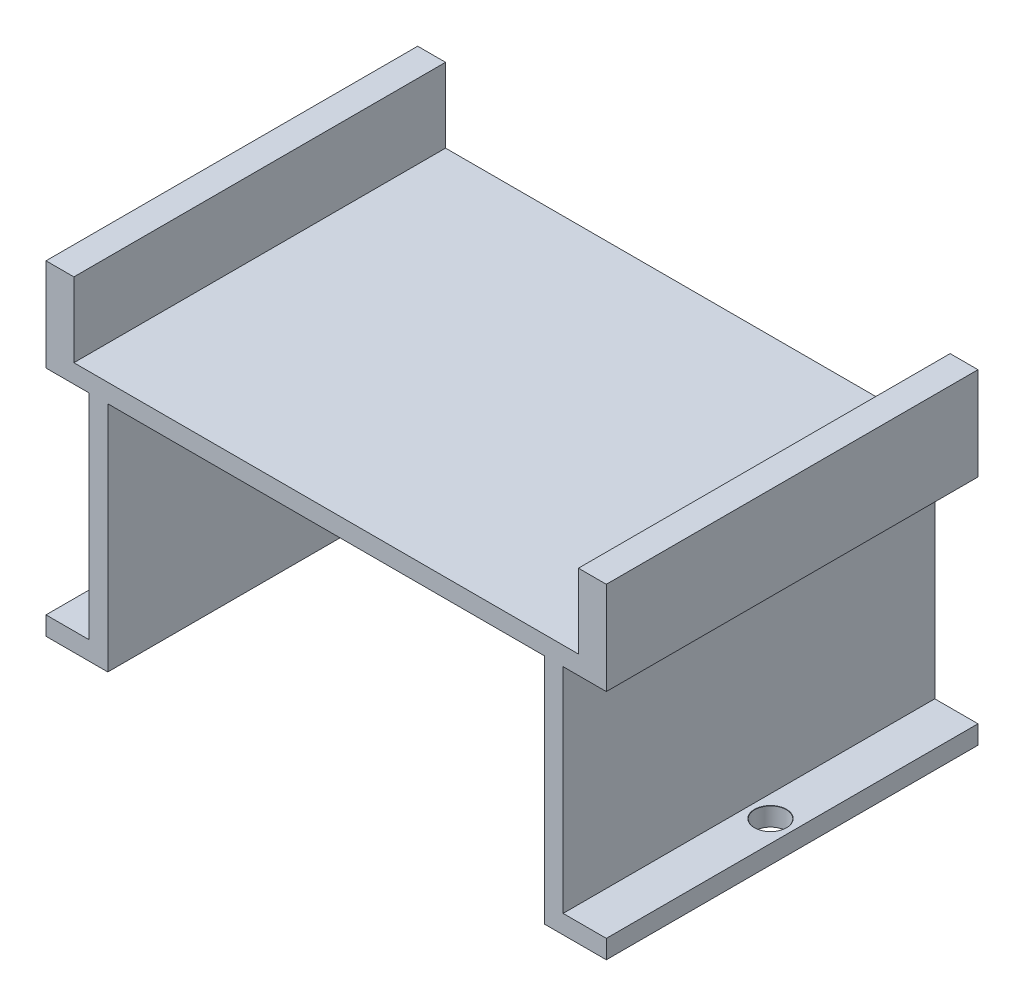
ISO-10303-21;
HEADER;
FILE_DESCRIPTION(('STEP AP214'),'2;1');
FILE_NAME('part.step','',(''),(''),'','','');
FILE_SCHEMA(('AUTOMOTIVE_DESIGN { 1 0 10303 214 1 1 1 1 }'));
ENDSEC;
DATA;
#1=APPLICATION_CONTEXT('core data for automotive mechanical design processes');
#2=APPLICATION_PROTOCOL_DEFINITION('international standard','automotive_design',2000,#1);
#3=PRODUCT_CONTEXT('',#1,'mechanical');
#4=PRODUCT('Part','Part','',(#3));
#5=PRODUCT_RELATED_PRODUCT_CATEGORY('part','',(#4));
#6=PRODUCT_DEFINITION_FORMATION('','',#4);
#7=PRODUCT_DEFINITION_CONTEXT('part definition',#1,'design');
#8=PRODUCT_DEFINITION('design','',#6,#7);
#9=PRODUCT_DEFINITION_SHAPE('','',#8);
#10=(LENGTH_UNIT() NAMED_UNIT(*) SI_UNIT(.MILLI.,.METRE.));
#11=(NAMED_UNIT(*) PLANE_ANGLE_UNIT() SI_UNIT($,.RADIAN.));
#12=(NAMED_UNIT(*) SI_UNIT($,.STERADIAN.) SOLID_ANGLE_UNIT());
#13=UNCERTAINTY_MEASURE_WITH_UNIT(LENGTH_MEASURE(1.E-05),#10,'distance_accuracy_value','');
#14=(GEOMETRIC_REPRESENTATION_CONTEXT(3) GLOBAL_UNCERTAINTY_ASSIGNED_CONTEXT((#13)) GLOBAL_UNIT_ASSIGNED_CONTEXT((#10,
#11,#12)) REPRESENTATION_CONTEXT('',''));
#15=CARTESIAN_POINT('',(0.,0.,0.));
#16=DIRECTION('',(0.,0.,1.));
#17=DIRECTION('',(1.,0.,0.));
#18=AXIS2_PLACEMENT_3D('',#15,#16,#17);
#19=CARTESIAN_POINT('',(30.15,17.5,40.));
#20=DIRECTION('',(-1.,0.,0.));
#21=DIRECTION('',(0.,-1.,0.));
#22=AXIS2_PLACEMENT_3D('',#19,#20,#21);
#23=PLANE('',#22);
#24=DIRECTION('',(0.,1.,0.));
#25=VECTOR('',#24,1.);
#26=CARTESIAN_POINT('',(30.15,17.5,40.));
#27=LINE('',#26,#25);
#28=CARTESIAN_POINT('',(30.15,7.5,40.));
#29=VERTEX_POINT('',#28);
#30=CARTESIAN_POINT('',(30.15,17.5,40.));
#31=VERTEX_POINT('',#30);
#32=EDGE_CURVE('E222',#29,#31,#27,.T.);
#33=ORIENTED_EDGE('',*,*,#32,.F.);
#34=DIRECTION('',(0.,0.,-1.));
#35=VECTOR('',#34,1.);
#36=CARTESIAN_POINT('',(30.15,7.5,40.));
#37=LINE('',#36,#35);
#38=CARTESIAN_POINT('',(30.15,7.5,0.));
#39=VERTEX_POINT('',#38);
#40=EDGE_CURVE('E241',#29,#39,#37,.T.);
#41=ORIENTED_EDGE('',*,*,#40,.T.);
#42=DIRECTION('',(0.,1.,0.));
#43=VECTOR('',#42,1.);
#44=CARTESIAN_POINT('',(30.15,17.5,0.));
#45=LINE('',#44,#43);
#46=CARTESIAN_POINT('',(30.15,17.5,0.));
#47=VERTEX_POINT('',#46);
#48=EDGE_CURVE('E321',#39,#47,#45,.T.);
#49=ORIENTED_EDGE('',*,*,#48,.T.);
#50=DIRECTION('',(0.,0.,-1.));
#51=VECTOR('',#50,1.);
#52=CARTESIAN_POINT('',(30.15,17.5,40.));
#53=LINE('',#52,#51);
#54=EDGE_CURVE('E11',#31,#47,#53,.T.);
#55=ORIENTED_EDGE('',*,*,#54,.F.);
#56=EDGE_LOOP('',(#33,#41,#49,#55));
#57=FACE_BOUND('',#56,.T.);
#58=ADVANCED_FACE('F45',(#57),#23,.F.);
#59=CARTESIAN_POINT('',(-30.15,17.5,40.));
#60=DIRECTION('',(0.,-1.,0.));
#61=DIRECTION('',(0.,0.,-1.));
#62=AXIS2_PLACEMENT_3D('',#59,#60,#61);
#63=PLANE('',#62);
#64=DIRECTION('',(-1.,0.,0.));
#65=VECTOR('',#64,1.);
#66=CARTESIAN_POINT('',(-30.15,17.5,0.));
#67=LINE('',#66,#65);
#68=CARTESIAN_POINT('',(27.15,17.5,0.));
#69=VERTEX_POINT('',#68);
#70=EDGE_CURVE('E212',#47,#69,#67,.T.);
#71=ORIENTED_EDGE('',*,*,#70,.T.);
#72=DIRECTION('',(0.,0.,-1.));
#73=VECTOR('',#72,1.);
#74=CARTESIAN_POINT('',(27.15,17.5,40.));
#75=LINE('',#74,#73);
#76=CARTESIAN_POINT('',(27.15,17.5,40.));
#77=VERTEX_POINT('',#76);
#78=EDGE_CURVE('E263',#77,#69,#75,.T.);
#79=ORIENTED_EDGE('',*,*,#78,.F.);
#80=DIRECTION('',(-1.,0.,0.));
#81=VECTOR('',#80,1.);
#82=CARTESIAN_POINT('',(-30.15,17.5,40.));
#83=LINE('',#82,#81);
#84=EDGE_CURVE('E332',#31,#77,#83,.T.);
#85=ORIENTED_EDGE('',*,*,#84,.F.);
#86=ORIENTED_EDGE('',*,*,#54,.T.);
#87=EDGE_LOOP('',(#71,#79,#85,#86));
#88=FACE_BOUND('',#87,.T.);
#89=ADVANCED_FACE('F352',(#88),#63,.F.);
#90=CARTESIAN_POINT('',(-30.15,17.5,40.));
#91=DIRECTION('',(1.,0.,0.));
#92=DIRECTION('',(0.,1.,0.));
#93=AXIS2_PLACEMENT_3D('',#90,#91,#92);
#94=PLANE('',#93);
#95=DIRECTION('',(0.,-1.,0.));
#96=VECTOR('',#95,1.);
#97=CARTESIAN_POINT('',(-30.15,17.5,40.));
#98=LINE('',#97,#96);
#99=CARTESIAN_POINT('',(-30.15,-15.5,40.));
#100=VERTEX_POINT('',#99);
#101=CARTESIAN_POINT('',(-30.15,-17.5,40.));
#102=VERTEX_POINT('',#101);
#103=EDGE_CURVE('E202',#100,#102,#98,.T.);
#104=ORIENTED_EDGE('',*,*,#103,.F.);
#105=DIRECTION('',(0.,0.,-1.));
#106=VECTOR('',#105,1.);
#107=CARTESIAN_POINT('',(-30.15,-15.5,40.));
#108=LINE('',#107,#106);
#109=CARTESIAN_POINT('',(-30.15,-15.5,0.));
#110=VERTEX_POINT('',#109);
#111=EDGE_CURVE('E186',#100,#110,#108,.T.);
#112=ORIENTED_EDGE('',*,*,#111,.T.);
#113=DIRECTION('',(0.,-1.,0.));
#114=VECTOR('',#113,1.);
#115=CARTESIAN_POINT('',(-30.15,17.5,0.));
#116=LINE('',#115,#114);
#117=CARTESIAN_POINT('',(-30.15,-17.5,0.));
#118=VERTEX_POINT('',#117);
#119=EDGE_CURVE('E200',#110,#118,#116,.T.);
#120=ORIENTED_EDGE('',*,*,#119,.T.);
#121=DIRECTION('',(0.,0.,-1.));
#122=VECTOR('',#121,1.);
#123=CARTESIAN_POINT('',(-30.15,-17.5,40.));
#124=LINE('',#123,#122);
#125=EDGE_CURVE('E226',#102,#118,#124,.T.);
#126=ORIENTED_EDGE('',*,*,#125,.F.);
#127=EDGE_LOOP('',(#104,#112,#120,#126));
#128=FACE_BOUND('',#127,.T.);
#129=ADVANCED_FACE('F198',(#128),#94,.F.);
#130=CARTESIAN_POINT('',(-30.15,-17.5,40.));
#131=DIRECTION('',(0.,1.,0.));
#132=DIRECTION('',(0.,0.,1.));
#133=AXIS2_PLACEMENT_3D('',#130,#131,#132);
#134=PLANE('',#133);
#135=CARTESIAN_POINT('',(27.82,-17.5,20.));
#136=DIRECTION('',(0.,1.,0.));
#137=DIRECTION('',(0.,0.,1.));
#138=AXIS2_PLACEMENT_3D('',#135,#136,#137);
#139=CIRCLE('',#138,1.69999999999999);
#140=CARTESIAN_POINT('',(27.82,-17.5,21.7));
#141=VERTEX_POINT('',#140);
#142=EDGE_CURVE('E401',#141,#141,#139,.T.);
#143=ORIENTED_EDGE('',*,*,#142,.T.);
#144=EDGE_LOOP('',(#143));
#145=FACE_BOUND('',#144,.T.);
#146=DIRECTION('',(1.,0.,0.));
#147=VECTOR('',#146,1.);
#148=CARTESIAN_POINT('',(-30.15,-17.5,40.));
#149=LINE('',#148,#147);
#150=CARTESIAN_POINT('',(23.5,-17.5,40.));
#151=VERTEX_POINT('',#150);
#152=CARTESIAN_POINT('',(30.15,-17.5,40.));
#153=VERTEX_POINT('',#152);
#154=EDGE_CURVE('E336',#151,#153,#149,.T.);
#155=ORIENTED_EDGE('',*,*,#154,.F.);
#156=DIRECTION('',(0.,0.,-1.));
#157=VECTOR('',#156,1.);
#158=CARTESIAN_POINT('',(23.5,-17.5,40.));
#159=LINE('',#158,#157);
#160=CARTESIAN_POINT('',(23.5,-17.5,0.));
#161=VERTEX_POINT('',#160);
#162=EDGE_CURVE('E312',#151,#161,#159,.T.);
#163=ORIENTED_EDGE('',*,*,#162,.T.);
#164=DIRECTION('',(1.,0.,0.));
#165=VECTOR('',#164,1.);
#166=CARTESIAN_POINT('',(-30.15,-17.5,0.));
#167=LINE('',#166,#165);
#168=CARTESIAN_POINT('',(30.15,-17.5,0.));
#169=VERTEX_POINT('',#168);
#170=EDGE_CURVE('E215',#161,#169,#167,.T.);
#171=ORIENTED_EDGE('',*,*,#170,.T.);
#172=DIRECTION('',(0.,0.,-1.));
#173=VECTOR('',#172,1.);
#174=CARTESIAN_POINT('',(30.15,-17.5,40.));
#175=LINE('',#174,#173);
#176=EDGE_CURVE('E223',#153,#169,#175,.T.);
#177=ORIENTED_EDGE('',*,*,#176,.F.);
#178=EDGE_LOOP('',(#155,#163,#171,#177));
#179=FACE_BOUND('',#178,.T.);
#180=ADVANCED_FACE('F370',(#145,#179),#134,.F.);
#181=CARTESIAN_POINT('',(30.15,-15.5,0.));
#182=VERTEX_POINT('',#181);
#183=EDGE_CURVE('E338',#169,#182,#45,.T.);
#184=ORIENTED_EDGE('',*,*,#183,.T.);
#185=DIRECTION('',(0.,0.,-1.));
#186=VECTOR('',#185,1.);
#187=CARTESIAN_POINT('',(30.15,-15.5,40.));
#188=LINE('',#187,#186);
#189=CARTESIAN_POINT('',(30.15,-15.5,40.));
#190=VERTEX_POINT('',#189);
#191=EDGE_CURVE('E281',#190,#182,#188,.T.);
#192=ORIENTED_EDGE('',*,*,#191,.F.);
#193=EDGE_CURVE('E328',#153,#190,#27,.T.);
#194=ORIENTED_EDGE('',*,*,#193,.F.);
#195=ORIENTED_EDGE('',*,*,#176,.T.);
#196=EDGE_LOOP('',(#184,#192,#194,#195));
#197=FACE_BOUND('',#196,.T.);
#198=ADVANCED_FACE('F47',(#197),#23,.F.);
#199=CARTESIAN_POINT('',(-27.15,17.5,40.));
#200=VERTEX_POINT('',#199);
#201=CARTESIAN_POINT('',(-30.15,17.5,40.));
#202=VERTEX_POINT('',#201);
#203=EDGE_CURVE('E331',#200,#202,#83,.T.);
#204=ORIENTED_EDGE('',*,*,#203,.F.);
#205=DIRECTION('',(0.,0.,-1.));
#206=VECTOR('',#205,1.);
#207=CARTESIAN_POINT('',(-27.15,17.5,40.));
#208=LINE('',#207,#206);
#209=CARTESIAN_POINT('',(-27.15,17.5,0.));
#210=VERTEX_POINT('',#209);
#211=EDGE_CURVE('E260',#200,#210,#208,.T.);
#212=ORIENTED_EDGE('',*,*,#211,.T.);
#213=CARTESIAN_POINT('',(-30.15,17.5,0.));
#214=VERTEX_POINT('',#213);
#215=EDGE_CURVE('E217',#210,#214,#67,.T.);
#216=ORIENTED_EDGE('',*,*,#215,.T.);
#217=DIRECTION('',(0.,0.,-1.));
#218=VECTOR('',#217,1.);
#219=CARTESIAN_POINT('',(-30.15,17.5,40.));
#220=LINE('',#219,#218);
#221=EDGE_CURVE('E53',#202,#214,#220,.T.);
#222=ORIENTED_EDGE('',*,*,#221,.F.);
#223=EDGE_LOOP('',(#204,#212,#216,#222));
#224=FACE_BOUND('',#223,.T.);
#225=ADVANCED_FACE('F428',(#224),#63,.F.);
#226=CARTESIAN_POINT('',(-30.15,7.5,0.));
#227=VERTEX_POINT('',#226);
#228=EDGE_CURVE('E211',#214,#227,#116,.T.);
#229=ORIENTED_EDGE('',*,*,#228,.T.);
#230=DIRECTION('',(0.,0.,-1.));
#231=VECTOR('',#230,1.);
#232=CARTESIAN_POINT('',(-30.15,7.5,40.));
#233=LINE('',#232,#231);
#234=CARTESIAN_POINT('',(-30.15,7.5,40.));
#235=VERTEX_POINT('',#234);
#236=EDGE_CURVE('E68',#235,#227,#233,.T.);
#237=ORIENTED_EDGE('',*,*,#236,.F.);
#238=EDGE_CURVE('E235',#202,#235,#98,.T.);
#239=ORIENTED_EDGE('',*,*,#238,.F.);
#240=ORIENTED_EDGE('',*,*,#221,.T.);
#241=EDGE_LOOP('',(#229,#237,#239,#240));
#242=FACE_BOUND('',#241,.T.);
#243=ADVANCED_FACE('F233',(#242),#94,.F.);
#244=CARTESIAN_POINT('',(-27.82,-17.5,20.));
#245=DIRECTION('',(0.,1.,0.));
#246=DIRECTION('',(0.,0.,1.));
#247=AXIS2_PLACEMENT_3D('',#244,#245,#246);
#248=CIRCLE('',#247,1.69999999999999);
#249=CARTESIAN_POINT('',(-27.82,-17.5,21.7));
#250=VERTEX_POINT('',#249);
#251=EDGE_CURVE('E203',#250,#250,#248,.T.);
#252=ORIENTED_EDGE('',*,*,#251,.T.);
#253=EDGE_LOOP('',(#252));
#254=FACE_BOUND('',#253,.T.);
#255=CARTESIAN_POINT('',(-23.5,-17.5,0.));
#256=VERTEX_POINT('',#255);
#257=EDGE_CURVE('E210',#118,#256,#167,.T.);
#258=ORIENTED_EDGE('',*,*,#257,.T.);
#259=DIRECTION('',(0.,0.,-1.));
#260=VECTOR('',#259,1.);
#261=CARTESIAN_POINT('',(-23.5,-17.5,40.));
#262=LINE('',#261,#260);
#263=CARTESIAN_POINT('',(-23.5,-17.5,40.));
#264=VERTEX_POINT('',#263);
#265=EDGE_CURVE('E324',#264,#256,#262,.T.);
#266=ORIENTED_EDGE('',*,*,#265,.F.);
#267=EDGE_CURVE('E227',#102,#264,#149,.T.);
#268=ORIENTED_EDGE('',*,*,#267,.F.);
#269=ORIENTED_EDGE('',*,*,#125,.T.);
#270=EDGE_LOOP('',(#258,#266,#268,#269));
#271=FACE_BOUND('',#270,.T.);
#272=ADVANCED_FACE('F383',(#254,#271),#134,.F.);
#273=CARTESIAN_POINT('',(0.,0.,40.));
#274=DIRECTION('',(0.,0.,1.));
#275=DIRECTION('',(1.,0.,0.));
#276=AXIS2_PLACEMENT_3D('',#273,#274,#275);
#277=PLANE('',#276);
#278=DIRECTION('',(0.,-1.,0.));
#279=VECTOR('',#278,1.);
#280=CARTESIAN_POINT('',(27.15,17.5,40.));
#281=LINE('',#280,#279);
#282=CARTESIAN_POINT('',(27.15,9.5,40.));
#283=VERTEX_POINT('',#282);
#284=EDGE_CURVE('E269',#77,#283,#281,.T.);
#285=ORIENTED_EDGE('',*,*,#284,.T.);
#286=DIRECTION('',(-1.,0.,0.));
#287=VECTOR('',#286,1.);
#288=CARTESIAN_POINT('',(27.15,9.5,40.));
#289=LINE('',#288,#287);
#290=CARTESIAN_POINT('',(-27.15,9.5,40.));
#291=VERTEX_POINT('',#290);
#292=EDGE_CURVE('E276',#283,#291,#289,.T.);
#293=ORIENTED_EDGE('',*,*,#292,.T.);
#294=DIRECTION('',(0.,1.,0.));
#295=VECTOR('',#294,1.);
#296=CARTESIAN_POINT('',(-27.15,17.5,40.));
#297=LINE('',#296,#295);
#298=EDGE_CURVE('E257',#291,#200,#297,.T.);
#299=ORIENTED_EDGE('',*,*,#298,.T.);
#300=ORIENTED_EDGE('',*,*,#203,.T.);
#301=ORIENTED_EDGE('',*,*,#238,.T.);
#302=DIRECTION('',(1.,0.,0.));
#303=VECTOR('',#302,1.);
#304=CARTESIAN_POINT('',(-30.15,7.5,40.));
#305=LINE('',#304,#303);
#306=CARTESIAN_POINT('',(-25.5,7.5,40.));
#307=VERTEX_POINT('',#306);
#308=EDGE_CURVE('E194',#235,#307,#305,.T.);
#309=ORIENTED_EDGE('',*,*,#308,.T.);
#310=DIRECTION('',(0.,-1.,0.));
#311=VECTOR('',#310,1.);
#312=CARTESIAN_POINT('',(-25.5,7.5,40.));
#313=LINE('',#312,#311);
#314=CARTESIAN_POINT('',(-25.5,-15.5,40.));
#315=VERTEX_POINT('',#314);
#316=EDGE_CURVE('E250',#307,#315,#313,.T.);
#317=ORIENTED_EDGE('',*,*,#316,.T.);
#318=DIRECTION('',(-1.,0.,0.));
#319=VECTOR('',#318,1.);
#320=CARTESIAN_POINT('',(-30.15,-15.5,40.));
#321=LINE('',#320,#319);
#322=EDGE_CURVE('E248',#315,#100,#321,.T.);
#323=ORIENTED_EDGE('',*,*,#322,.T.);
#324=ORIENTED_EDGE('',*,*,#103,.T.);
#325=ORIENTED_EDGE('',*,*,#267,.T.);
#326=DIRECTION('',(0.,1.,0.));
#327=VECTOR('',#326,1.);
#328=CARTESIAN_POINT('',(-23.5,7.5,40.));
#329=LINE('',#328,#327);
#330=CARTESIAN_POINT('',(-23.5,7.5,40.));
#331=VERTEX_POINT('',#330);
#332=EDGE_CURVE('E305',#264,#331,#329,.T.);
#333=ORIENTED_EDGE('',*,*,#332,.T.);
#334=DIRECTION('',(1.,0.,0.));
#335=VECTOR('',#334,1.);
#336=CARTESIAN_POINT('',(23.5,7.5,40.));
#337=LINE('',#336,#335);
#338=CARTESIAN_POINT('',(23.5,7.5,40.));
#339=VERTEX_POINT('',#338);
#340=EDGE_CURVE('E309',#331,#339,#337,.T.);
#341=ORIENTED_EDGE('',*,*,#340,.T.);
#342=DIRECTION('',(0.,-1.,0.));
#343=VECTOR('',#342,1.);
#344=CARTESIAN_POINT('',(23.5,7.5,40.));
#345=LINE('',#344,#343);
#346=EDGE_CURVE('E302',#339,#151,#345,.T.);
#347=ORIENTED_EDGE('',*,*,#346,.T.);
#348=ORIENTED_EDGE('',*,*,#154,.T.);
#349=ORIENTED_EDGE('',*,*,#193,.T.);
#350=DIRECTION('',(-1.,0.,0.));
#351=VECTOR('',#350,1.);
#352=CARTESIAN_POINT('',(30.15,-15.5,40.));
#353=LINE('',#352,#351);
#354=CARTESIAN_POINT('',(25.5,-15.5,40.));
#355=VERTEX_POINT('',#354);
#356=EDGE_CURVE('E290',#190,#355,#353,.T.);
#357=ORIENTED_EDGE('',*,*,#356,.T.);
#358=DIRECTION('',(0.,1.,0.));
#359=VECTOR('',#358,1.);
#360=CARTESIAN_POINT('',(25.5,7.5,40.));
#361=LINE('',#360,#359);
#362=CARTESIAN_POINT('',(25.5,7.5,40.));
#363=VERTEX_POINT('',#362);
#364=EDGE_CURVE('E297',#355,#363,#361,.T.);
#365=ORIENTED_EDGE('',*,*,#364,.T.);
#366=DIRECTION('',(1.,0.,0.));
#367=VECTOR('',#366,1.);
#368=CARTESIAN_POINT('',(30.15,7.5,40.));
#369=LINE('',#368,#367);
#370=EDGE_CURVE('E283',#363,#29,#369,.T.);
#371=ORIENTED_EDGE('',*,*,#370,.T.);
#372=ORIENTED_EDGE('',*,*,#32,.T.);
#373=ORIENTED_EDGE('',*,*,#84,.T.);
#374=EDGE_LOOP('',(#285,#293,#299,#300,#301,#309,#317,#323,#324,#325,#333,#341,#347,#348,#349,
#357,#365,#371,#372,#373));
#375=FACE_BOUND('',#374,.T.);
#376=ADVANCED_FACE('F354',(#375),#277,.T.);
#377=CARTESIAN_POINT('',(0.,0.,0.));
#378=DIRECTION('',(0.,0.,1.));
#379=DIRECTION('',(1.,0.,0.));
#380=AXIS2_PLACEMENT_3D('',#377,#378,#379);
#381=PLANE('',#380);
#382=DIRECTION('',(-1.,0.,0.));
#383=VECTOR('',#382,1.);
#384=CARTESIAN_POINT('',(27.15,9.5,0.));
#385=LINE('',#384,#383);
#386=CARTESIAN_POINT('',(27.15,9.5,0.));
#387=VERTEX_POINT('',#386);
#388=CARTESIAN_POINT('',(-27.15,9.5,0.));
#389=VERTEX_POINT('',#388);
#390=EDGE_CURVE('E268',#387,#389,#385,.T.);
#391=ORIENTED_EDGE('',*,*,#390,.F.);
#392=DIRECTION('',(0.,-1.,0.));
#393=VECTOR('',#392,1.);
#394=CARTESIAN_POINT('',(27.15,17.5,0.));
#395=LINE('',#394,#393);
#396=EDGE_CURVE('E60',#69,#387,#395,.T.);
#397=ORIENTED_EDGE('',*,*,#396,.F.);
#398=ORIENTED_EDGE('',*,*,#70,.F.);
#399=ORIENTED_EDGE('',*,*,#48,.F.);
#400=DIRECTION('',(1.,0.,0.));
#401=VECTOR('',#400,1.);
#402=CARTESIAN_POINT('',(30.15,7.5,0.));
#403=LINE('',#402,#401);
#404=CARTESIAN_POINT('',(25.5,7.5,0.));
#405=VERTEX_POINT('',#404);
#406=EDGE_CURVE('E287',#405,#39,#403,.T.);
#407=ORIENTED_EDGE('',*,*,#406,.F.);
#408=DIRECTION('',(0.,1.,0.));
#409=VECTOR('',#408,1.);
#410=CARTESIAN_POINT('',(25.5,7.5,0.));
#411=LINE('',#410,#409);
#412=CARTESIAN_POINT('',(25.5,-15.5,0.));
#413=VERTEX_POINT('',#412);
#414=EDGE_CURVE('E289',#413,#405,#411,.T.);
#415=ORIENTED_EDGE('',*,*,#414,.F.);
#416=DIRECTION('',(-1.,0.,0.));
#417=VECTOR('',#416,1.);
#418=CARTESIAN_POINT('',(30.15,-15.5,0.));
#419=LINE('',#418,#417);
#420=EDGE_CURVE('E265',#182,#413,#419,.T.);
#421=ORIENTED_EDGE('',*,*,#420,.F.);
#422=ORIENTED_EDGE('',*,*,#183,.F.);
#423=ORIENTED_EDGE('',*,*,#170,.F.);
#424=DIRECTION('',(0.,-1.,0.));
#425=VECTOR('',#424,1.);
#426=CARTESIAN_POINT('',(23.5,7.5,0.));
#427=LINE('',#426,#425);
#428=CARTESIAN_POINT('',(23.5,7.5,0.));
#429=VERTEX_POINT('',#428);
#430=EDGE_CURVE('E273',#429,#161,#427,.T.);
#431=ORIENTED_EDGE('',*,*,#430,.F.);
#432=DIRECTION('',(1.,0.,0.));
#433=VECTOR('',#432,1.);
#434=CARTESIAN_POINT('',(23.5,7.5,0.));
#435=LINE('',#434,#433);
#436=CARTESIAN_POINT('',(-23.5,7.5,0.));
#437=VERTEX_POINT('',#436);
#438=EDGE_CURVE('E306',#437,#429,#435,.T.);
#439=ORIENTED_EDGE('',*,*,#438,.F.);
#440=DIRECTION('',(0.,1.,0.));
#441=VECTOR('',#440,1.);
#442=CARTESIAN_POINT('',(-23.5,7.5,0.));
#443=LINE('',#442,#441);
#444=EDGE_CURVE('E314',#256,#437,#443,.T.);
#445=ORIENTED_EDGE('',*,*,#444,.F.);
#446=ORIENTED_EDGE('',*,*,#257,.F.);
#447=ORIENTED_EDGE('',*,*,#119,.F.);
#448=DIRECTION('',(-1.,0.,0.));
#449=VECTOR('',#448,1.);
#450=CARTESIAN_POINT('',(-30.15,-15.5,0.));
#451=LINE('',#450,#449);
#452=CARTESIAN_POINT('',(-25.5,-15.5,0.));
#453=VERTEX_POINT('',#452);
#454=EDGE_CURVE('E182',#453,#110,#451,.T.);
#455=ORIENTED_EDGE('',*,*,#454,.F.);
#456=DIRECTION('',(0.,-1.,0.));
#457=VECTOR('',#456,1.);
#458=CARTESIAN_POINT('',(-25.5,7.5,0.));
#459=LINE('',#458,#457);
#460=CARTESIAN_POINT('',(-25.5,7.5,0.));
#461=VERTEX_POINT('',#460);
#462=EDGE_CURVE('E193',#461,#453,#459,.T.);
#463=ORIENTED_EDGE('',*,*,#462,.F.);
#464=DIRECTION('',(1.,0.,0.));
#465=VECTOR('',#464,1.);
#466=CARTESIAN_POINT('',(-30.15,7.5,0.));
#467=LINE('',#466,#465);
#468=EDGE_CURVE('E240',#227,#461,#467,.T.);
#469=ORIENTED_EDGE('',*,*,#468,.F.);
#470=ORIENTED_EDGE('',*,*,#228,.F.);
#471=ORIENTED_EDGE('',*,*,#215,.F.);
#472=DIRECTION('',(0.,1.,0.));
#473=VECTOR('',#472,1.);
#474=CARTESIAN_POINT('',(-27.15,17.5,0.));
#475=LINE('',#474,#473);
#476=EDGE_CURVE('E266',#389,#210,#475,.T.);
#477=ORIENTED_EDGE('',*,*,#476,.F.);
#478=EDGE_LOOP('',(#391,#397,#398,#399,#407,#415,#421,#422,#423,#431,#439,#445,#446,#447,#455,
#463,#469,#470,#471,#477));
#479=FACE_BOUND('',#478,.T.);
#480=ADVANCED_FACE('F207',(#479),#381,.F.);
#481=CARTESIAN_POINT('',(23.5,7.5,40.));
#482=DIRECTION('',(1.,0.,0.));
#483=DIRECTION('',(0.,1.,0.));
#484=AXIS2_PLACEMENT_3D('',#481,#482,#483);
#485=PLANE('',#484);
#486=ORIENTED_EDGE('',*,*,#430,.T.);
#487=ORIENTED_EDGE('',*,*,#162,.F.);
#488=ORIENTED_EDGE('',*,*,#346,.F.);
#489=DIRECTION('',(0.,0.,-1.));
#490=VECTOR('',#489,1.);
#491=CARTESIAN_POINT('',(23.5,7.5,40.));
#492=LINE('',#491,#490);
#493=EDGE_CURVE('E319',#339,#429,#492,.T.);
#494=ORIENTED_EDGE('',*,*,#493,.T.);
#495=EDGE_LOOP('',(#486,#487,#488,#494));
#496=FACE_BOUND('',#495,.T.);
#497=ADVANCED_FACE('F375',(#496),#485,.F.);
#498=CARTESIAN_POINT('',(23.5,7.5,40.));
#499=DIRECTION('',(0.,1.,0.));
#500=DIRECTION('',(0.,0.,1.));
#501=AXIS2_PLACEMENT_3D('',#498,#499,#500);
#502=PLANE('',#501);
#503=ORIENTED_EDGE('',*,*,#438,.T.);
#504=ORIENTED_EDGE('',*,*,#493,.F.);
#505=ORIENTED_EDGE('',*,*,#340,.F.);
#506=DIRECTION('',(0.,0.,-1.));
#507=VECTOR('',#506,1.);
#508=CARTESIAN_POINT('',(-23.5,7.5,40.));
#509=LINE('',#508,#507);
#510=EDGE_CURVE('E322',#331,#437,#509,.T.);
#511=ORIENTED_EDGE('',*,*,#510,.T.);
#512=EDGE_LOOP('',(#503,#504,#505,#511));
#513=FACE_BOUND('',#512,.T.);
#514=ADVANCED_FACE('F378',(#513),#502,.F.);
#515=CARTESIAN_POINT('',(-23.5,7.5,40.));
#516=DIRECTION('',(-1.,0.,0.));
#517=DIRECTION('',(0.,-1.,0.));
#518=AXIS2_PLACEMENT_3D('',#515,#516,#517);
#519=PLANE('',#518);
#520=ORIENTED_EDGE('',*,*,#444,.T.);
#521=ORIENTED_EDGE('',*,*,#510,.F.);
#522=ORIENTED_EDGE('',*,*,#332,.F.);
#523=ORIENTED_EDGE('',*,*,#265,.T.);
#524=EDGE_LOOP('',(#520,#521,#522,#523));
#525=FACE_BOUND('',#524,.T.);
#526=ADVANCED_FACE('F380',(#525),#519,.F.);
#527=CARTESIAN_POINT('',(-30.15,-15.5,40.));
#528=DIRECTION('',(0.,-1.,0.));
#529=DIRECTION('',(1.,0.,0.));
#530=AXIS2_PLACEMENT_3D('',#527,#528,#529);
#531=PLANE('',#530);
#532=CARTESIAN_POINT('',(-27.82,-15.5,20.));
#533=DIRECTION('',(0.,1.,0.));
#534=DIRECTION('',(0.,0.,1.));
#535=AXIS2_PLACEMENT_3D('',#532,#533,#534);
#536=CIRCLE('',#535,1.725);
#537=CARTESIAN_POINT('',(-27.82,-15.5,21.725));
#538=VERTEX_POINT('',#537);
#539=EDGE_CURVE('E398',#538,#538,#536,.T.);
#540=ORIENTED_EDGE('',*,*,#539,.F.);
#541=EDGE_LOOP('',(#540));
#542=FACE_BOUND('',#541,.T.);
#543=ORIENTED_EDGE('',*,*,#454,.T.);
#544=ORIENTED_EDGE('',*,*,#111,.F.);
#545=ORIENTED_EDGE('',*,*,#322,.F.);
#546=DIRECTION('',(0.,0.,-1.));
#547=VECTOR('',#546,1.);
#548=CARTESIAN_POINT('',(-25.5,-15.5,40.));
#549=LINE('',#548,#547);
#550=EDGE_CURVE('E188',#315,#453,#549,.T.);
#551=ORIENTED_EDGE('',*,*,#550,.T.);
#552=EDGE_LOOP('',(#543,#544,#545,#551));
#553=FACE_BOUND('',#552,.T.);
#554=ADVANCED_FACE('F184',(#542,#553),#531,.F.);
#555=CARTESIAN_POINT('',(-25.5,7.5,40.));
#556=DIRECTION('',(1.,0.,0.));
#557=DIRECTION('',(0.,1.,0.));
#558=AXIS2_PLACEMENT_3D('',#555,#556,#557);
#559=PLANE('',#558);
#560=ORIENTED_EDGE('',*,*,#462,.T.);
#561=ORIENTED_EDGE('',*,*,#550,.F.);
#562=ORIENTED_EDGE('',*,*,#316,.F.);
#563=DIRECTION('',(0.,0.,-1.));
#564=VECTOR('',#563,1.);
#565=CARTESIAN_POINT('',(-25.5,7.5,40.));
#566=LINE('',#565,#564);
#567=EDGE_CURVE('E388',#307,#461,#566,.T.);
#568=ORIENTED_EDGE('',*,*,#567,.T.);
#569=EDGE_LOOP('',(#560,#561,#562,#568));
#570=FACE_BOUND('',#569,.T.);
#571=ADVANCED_FACE('F387',(#570),#559,.F.);
#572=CARTESIAN_POINT('',(-30.15,7.5,40.));
#573=DIRECTION('',(0.,1.,0.));
#574=DIRECTION('',(-1.,0.,0.));
#575=AXIS2_PLACEMENT_3D('',#572,#573,#574);
#576=PLANE('',#575);
#577=ORIENTED_EDGE('',*,*,#468,.T.);
#578=ORIENTED_EDGE('',*,*,#567,.F.);
#579=ORIENTED_EDGE('',*,*,#308,.F.);
#580=ORIENTED_EDGE('',*,*,#236,.T.);
#581=EDGE_LOOP('',(#577,#578,#579,#580));
#582=FACE_BOUND('',#581,.T.);
#583=ADVANCED_FACE('F470',(#582),#576,.F.);
#584=CARTESIAN_POINT('',(30.15,7.5,40.));
#585=DIRECTION('',(0.,1.,0.));
#586=DIRECTION('',(0.,0.,1.));
#587=AXIS2_PLACEMENT_3D('',#584,#585,#586);
#588=PLANE('',#587);
#589=ORIENTED_EDGE('',*,*,#406,.T.);
#590=ORIENTED_EDGE('',*,*,#40,.F.);
#591=ORIENTED_EDGE('',*,*,#370,.F.);
#592=DIRECTION('',(0.,0.,-1.));
#593=VECTOR('',#592,1.);
#594=CARTESIAN_POINT('',(25.5,7.5,40.));
#595=LINE('',#594,#593);
#596=EDGE_CURVE('E244',#363,#405,#595,.T.);
#597=ORIENTED_EDGE('',*,*,#596,.T.);
#598=EDGE_LOOP('',(#589,#590,#591,#597));
#599=FACE_BOUND('',#598,.T.);
#600=ADVANCED_FACE('F358',(#599),#588,.F.);
#601=CARTESIAN_POINT('',(25.5,7.5,40.));
#602=DIRECTION('',(-1.,0.,0.));
#603=DIRECTION('',(0.,-1.,0.));
#604=AXIS2_PLACEMENT_3D('',#601,#602,#603);
#605=PLANE('',#604);
#606=ORIENTED_EDGE('',*,*,#414,.T.);
#607=ORIENTED_EDGE('',*,*,#596,.F.);
#608=ORIENTED_EDGE('',*,*,#364,.F.);
#609=DIRECTION('',(0.,0.,-1.));
#610=VECTOR('',#609,1.);
#611=CARTESIAN_POINT('',(25.5,-15.5,40.));
#612=LINE('',#611,#610);
#613=EDGE_CURVE('E284',#355,#413,#612,.T.);
#614=ORIENTED_EDGE('',*,*,#613,.T.);
#615=EDGE_LOOP('',(#606,#607,#608,#614));
#616=FACE_BOUND('',#615,.T.);
#617=ADVANCED_FACE('F362',(#616),#605,.F.);
#618=CARTESIAN_POINT('',(30.15,-15.5,40.));
#619=DIRECTION('',(0.,-1.,0.));
#620=DIRECTION('',(0.,0.,-1.));
#621=AXIS2_PLACEMENT_3D('',#618,#619,#620);
#622=PLANE('',#621);
#623=CARTESIAN_POINT('',(27.82,-15.5,20.));
#624=DIRECTION('',(0.,1.,0.));
#625=DIRECTION('',(0.,0.,1.));
#626=AXIS2_PLACEMENT_3D('',#623,#624,#625);
#627=CIRCLE('',#626,1.725);
#628=CARTESIAN_POINT('',(27.82,-15.5,21.725));
#629=VERTEX_POINT('',#628);
#630=EDGE_CURVE('E407',#629,#629,#627,.T.);
#631=ORIENTED_EDGE('',*,*,#630,.F.);
#632=EDGE_LOOP('',(#631));
#633=FACE_BOUND('',#632,.T.);
#634=ORIENTED_EDGE('',*,*,#420,.T.);
#635=ORIENTED_EDGE('',*,*,#613,.F.);
#636=ORIENTED_EDGE('',*,*,#356,.F.);
#637=ORIENTED_EDGE('',*,*,#191,.T.);
#638=EDGE_LOOP('',(#634,#635,#636,#637));
#639=FACE_BOUND('',#638,.T.);
#640=ADVANCED_FACE('F364',(#633,#639),#622,.F.);
#641=CARTESIAN_POINT('',(27.15,17.5,40.));
#642=DIRECTION('',(1.,0.,0.));
#643=DIRECTION('',(0.,1.,0.));
#644=AXIS2_PLACEMENT_3D('',#641,#642,#643);
#645=PLANE('',#644);
#646=ORIENTED_EDGE('',*,*,#396,.T.);
#647=DIRECTION('',(0.,0.,-1.));
#648=VECTOR('',#647,1.);
#649=CARTESIAN_POINT('',(27.15,9.5,40.));
#650=LINE('',#649,#648);
#651=EDGE_CURVE('E255',#283,#387,#650,.T.);
#652=ORIENTED_EDGE('',*,*,#651,.F.);
#653=ORIENTED_EDGE('',*,*,#284,.F.);
#654=ORIENTED_EDGE('',*,*,#78,.T.);
#655=EDGE_LOOP('',(#646,#652,#653,#654));
#656=FACE_BOUND('',#655,.T.);
#657=ADVANCED_FACE('F414',(#656),#645,.F.);
#658=CARTESIAN_POINT('',(-27.15,17.5,40.));
#659=DIRECTION('',(-1.,0.,0.));
#660=DIRECTION('',(0.,-1.,0.));
#661=AXIS2_PLACEMENT_3D('',#658,#659,#660);
#662=PLANE('',#661);
#663=ORIENTED_EDGE('',*,*,#476,.T.);
#664=ORIENTED_EDGE('',*,*,#211,.F.);
#665=ORIENTED_EDGE('',*,*,#298,.F.);
#666=DIRECTION('',(0.,0.,-1.));
#667=VECTOR('',#666,1.);
#668=CARTESIAN_POINT('',(-27.15,9.5,40.));
#669=LINE('',#668,#667);
#670=EDGE_CURVE('E258',#291,#389,#669,.T.);
#671=ORIENTED_EDGE('',*,*,#670,.T.);
#672=EDGE_LOOP('',(#663,#664,#665,#671));
#673=FACE_BOUND('',#672,.T.);
#674=ADVANCED_FACE('F420',(#673),#662,.F.);
#675=CARTESIAN_POINT('',(27.15,9.5,40.));
#676=DIRECTION('',(0.,-1.,0.));
#677=DIRECTION('',(0.,0.,-1.));
#678=AXIS2_PLACEMENT_3D('',#675,#676,#677);
#679=PLANE('',#678);
#680=ORIENTED_EDGE('',*,*,#390,.T.);
#681=ORIENTED_EDGE('',*,*,#670,.F.);
#682=ORIENTED_EDGE('',*,*,#292,.F.);
#683=ORIENTED_EDGE('',*,*,#651,.T.);
#684=EDGE_LOOP('',(#680,#681,#682,#683));
#685=FACE_BOUND('',#684,.T.);
#686=ADVANCED_FACE('F454',(#685),#679,.F.);
#687=CARTESIAN_POINT('',(-27.82,-15.5,20.));
#688=DIRECTION('',(0.,1.,0.));
#689=DIRECTION('',(0.,0.,1.));
#690=AXIS2_PLACEMENT_3D('',#687,#688,#689);
#691=CYLINDRICAL_SURFACE('',#690,1.69999999999999);
#692=ORIENTED_EDGE('',*,*,#251,.F.);
#693=EDGE_LOOP('',(#692));
#694=FACE_BOUND('',#693,.T.);
#695=CARTESIAN_POINT('',(-27.82,-15.525,20.));
#696=DIRECTION('',(0.,1.,0.));
#697=DIRECTION('',(0.,0.,1.));
#698=AXIS2_PLACEMENT_3D('',#695,#696,#697);
#699=CIRCLE('',#698,1.69999999999999);
#700=CARTESIAN_POINT('',(-27.82,-15.525,21.7));
#701=VERTEX_POINT('',#700);
#702=EDGE_CURVE('E395',#701,#701,#699,.T.);
#703=ORIENTED_EDGE('',*,*,#702,.T.);
#704=EDGE_LOOP('',(#703));
#705=FACE_BOUND('',#704,.T.);
#706=ADVANCED_FACE('F450',(#694,#705),#691,.F.);
#707=CARTESIAN_POINT('',(-27.82,-15.5,20.));
#708=DIRECTION('',(0.,1.,0.));
#709=DIRECTION('',(0.,0.,1.));
#710=AXIS2_PLACEMENT_3D('',#707,#708,#709);
#711=CONICAL_SURFACE('',#710,1.725,0.785398163397136);
#712=ORIENTED_EDGE('',*,*,#702,.F.);
#713=EDGE_LOOP('',(#712));
#714=FACE_BOUND('',#713,.T.);
#715=ORIENTED_EDGE('',*,*,#539,.T.);
#716=EDGE_LOOP('',(#715));
#717=FACE_BOUND('',#716,.T.);
#718=ADVANCED_FACE('F453',(#714,#717),#711,.F.);
#719=CARTESIAN_POINT('',(27.82,-15.5,20.));
#720=DIRECTION('',(0.,1.,0.));
#721=DIRECTION('',(0.,0.,1.));
#722=AXIS2_PLACEMENT_3D('',#719,#720,#721);
#723=CYLINDRICAL_SURFACE('',#722,1.69999999999999);
#724=ORIENTED_EDGE('',*,*,#142,.F.);
#725=EDGE_LOOP('',(#724));
#726=FACE_BOUND('',#725,.T.);
#727=CARTESIAN_POINT('',(27.82,-15.525,20.));
#728=DIRECTION('',(0.,1.,0.));
#729=DIRECTION('',(0.,0.,1.));
#730=AXIS2_PLACEMENT_3D('',#727,#728,#729);
#731=CIRCLE('',#730,1.69999999999999);
#732=CARTESIAN_POINT('',(27.82,-15.525,21.7));
#733=VERTEX_POINT('',#732);
#734=EDGE_CURVE('E404',#733,#733,#731,.T.);
#735=ORIENTED_EDGE('',*,*,#734,.T.);
#736=EDGE_LOOP('',(#735));
#737=FACE_BOUND('',#736,.T.);
#738=ADVANCED_FACE('F460',(#726,#737),#723,.F.);
#739=CARTESIAN_POINT('',(27.82,-15.5,20.));
#740=DIRECTION('',(0.,1.,0.));
#741=DIRECTION('',(0.,0.,1.));
#742=AXIS2_PLACEMENT_3D('',#739,#740,#741);
#743=CONICAL_SURFACE('',#742,1.725,0.785398163397136);
#744=ORIENTED_EDGE('',*,*,#734,.F.);
#745=EDGE_LOOP('',(#744));
#746=FACE_BOUND('',#745,.T.);
#747=ORIENTED_EDGE('',*,*,#630,.T.);
#748=EDGE_LOOP('',(#747));
#749=FACE_BOUND('',#748,.T.);
#750=ADVANCED_FACE('F411',(#746,#749),#743,.F.);
#751=CLOSED_SHELL('',(#58,#89,#129,#180,#198,#225,#243,#272,#376,#480,#497,#514,#526,#554,#571,
#583,#600,#617,#640,#657,#674,#686,#706,#718,#738,#750));
#752=MANIFOLD_SOLID_BREP('B2',#751);
#753=ADVANCED_BREP_SHAPE_REPRESENTATION('',(#18,#752),#14);
#754=SHAPE_DEFINITION_REPRESENTATION(#9,#753);
ENDSEC;
END-ISO-10303-21;
